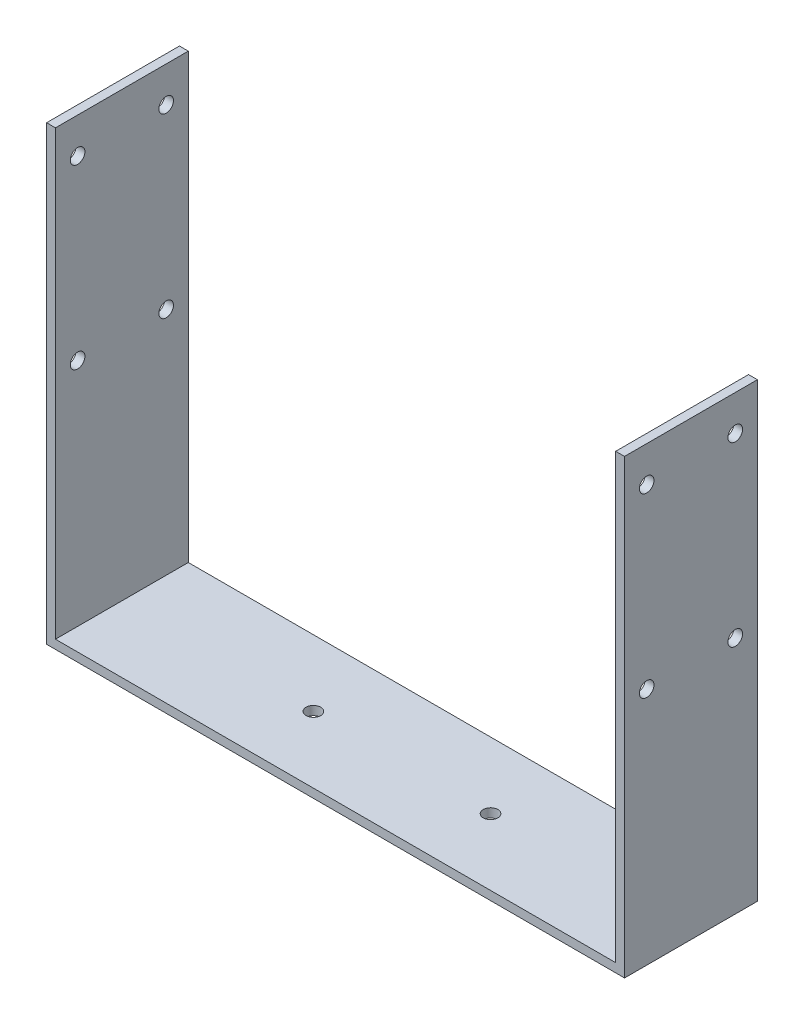
ISO-10303-21;
HEADER;
FILE_DESCRIPTION(('STEP AP214'),'2;1');
FILE_NAME('part.step','',(''),(''),'','','');
FILE_SCHEMA(('AUTOMOTIVE_DESIGN { 1 0 10303 214 1 1 1 1 }'));
ENDSEC;
DATA;
#1=APPLICATION_CONTEXT('core data for automotive mechanical design processes');
#2=APPLICATION_PROTOCOL_DEFINITION('international standard','automotive_design',2000,#1);
#3=PRODUCT_CONTEXT('',#1,'mechanical');
#4=PRODUCT('Part','Part','',(#3));
#5=PRODUCT_RELATED_PRODUCT_CATEGORY('part','',(#4));
#6=PRODUCT_DEFINITION_FORMATION('','',#4);
#7=PRODUCT_DEFINITION_CONTEXT('part definition',#1,'design');
#8=PRODUCT_DEFINITION('design','',#6,#7);
#9=PRODUCT_DEFINITION_SHAPE('','',#8);
#10=(LENGTH_UNIT() NAMED_UNIT(*) SI_UNIT(.MILLI.,.METRE.));
#11=(NAMED_UNIT(*) PLANE_ANGLE_UNIT() SI_UNIT($,.RADIAN.));
#12=(NAMED_UNIT(*) SI_UNIT($,.STERADIAN.) SOLID_ANGLE_UNIT());
#13=UNCERTAINTY_MEASURE_WITH_UNIT(LENGTH_MEASURE(1.E-05),#10,'distance_accuracy_value','');
#14=(GEOMETRIC_REPRESENTATION_CONTEXT(3) GLOBAL_UNCERTAINTY_ASSIGNED_CONTEXT((#13)) GLOBAL_UNIT_ASSIGNED_CONTEXT((#10,
#11,#12)) REPRESENTATION_CONTEXT('',''));
#15=CARTESIAN_POINT('',(0.,0.,0.));
#16=DIRECTION('',(0.,0.,1.));
#17=DIRECTION('',(1.,0.,0.));
#18=AXIS2_PLACEMENT_3D('',#15,#16,#17);
#19=CARTESIAN_POINT('',(0.,0.,30.));
#20=DIRECTION('',(-1.,0.,0.));
#21=DIRECTION('',(0.,0.,1.));
#22=AXIS2_PLACEMENT_3D('',#19,#20,#21);
#23=PLANE('',#22);
#24=CARTESIAN_POINT('',(0.,92.,5.));
#25=DIRECTION('',(-1.,0.,0.));
#26=DIRECTION('',(0.,0.,1.));
#27=AXIS2_PLACEMENT_3D('',#24,#25,#26);
#28=CIRCLE('',#27,1.65);
#29=CARTESIAN_POINT('',(0.,92.,6.65));
#30=VERTEX_POINT('',#29);
#31=EDGE_CURVE('E190',#30,#30,#28,.F.);
#32=ORIENTED_EDGE('',*,*,#31,.F.);
#33=EDGE_LOOP('',(#32));
#34=FACE_BOUND('',#33,.T.);
#35=DIRECTION('',(0.,1.,0.));
#36=VECTOR('',#35,1.);
#37=CARTESIAN_POINT('',(0.,0.,0.));
#38=LINE('',#37,#36);
#39=CARTESIAN_POINT('',(0.,0.,0.));
#40=VERTEX_POINT('',#39);
#41=CARTESIAN_POINT('',(0.,100.,0.));
#42=VERTEX_POINT('',#41);
#43=EDGE_CURVE('E144',#40,#42,#38,.T.);
#44=ORIENTED_EDGE('',*,*,#43,.T.);
#45=DIRECTION('',(0.,0.,-1.));
#46=VECTOR('',#45,1.);
#47=CARTESIAN_POINT('',(0.,100.,30.));
#48=LINE('',#47,#46);
#49=CARTESIAN_POINT('',(0.,100.,30.));
#50=VERTEX_POINT('',#49);
#51=EDGE_CURVE('E11',#50,#42,#48,.T.);
#52=ORIENTED_EDGE('',*,*,#51,.F.);
#53=DIRECTION('',(0.,1.,0.));
#54=VECTOR('',#53,1.);
#55=CARTESIAN_POINT('',(0.,0.,30.));
#56=LINE('',#55,#54);
#57=CARTESIAN_POINT('',(0.,0.,30.));
#58=VERTEX_POINT('',#57);
#59=EDGE_CURVE('E167',#58,#50,#56,.T.);
#60=ORIENTED_EDGE('',*,*,#59,.F.);
#61=DIRECTION('',(0.,0.,-1.));
#62=VECTOR('',#61,1.);
#63=CARTESIAN_POINT('',(0.,0.,30.));
#64=LINE('',#63,#62);
#65=EDGE_CURVE('E140',#58,#40,#64,.T.);
#66=ORIENTED_EDGE('',*,*,#65,.T.);
#67=EDGE_LOOP('',(#44,#52,#60,#66));
#68=FACE_BOUND('',#67,.T.);
#69=CARTESIAN_POINT('',(0.,92.,25.));
#70=DIRECTION('',(-1.,0.,0.));
#71=DIRECTION('',(0.,0.,1.));
#72=AXIS2_PLACEMENT_3D('',#69,#70,#71);
#73=CIRCLE('',#72,1.65);
#74=CARTESIAN_POINT('',(0.,92.,26.65));
#75=VERTEX_POINT('',#74);
#76=EDGE_CURVE('E149',#75,#75,#73,.T.);
#77=ORIENTED_EDGE('',*,*,#76,.T.);
#78=EDGE_LOOP('',(#77));
#79=FACE_BOUND('',#78,.T.);
#80=CARTESIAN_POINT('',(0.,52.,5.));
#81=DIRECTION('',(-1.,0.,0.));
#82=DIRECTION('',(0.,0.,1.));
#83=AXIS2_PLACEMENT_3D('',#80,#81,#82);
#84=CIRCLE('',#83,1.65);
#85=CARTESIAN_POINT('',(0.,52.,6.65));
#86=VERTEX_POINT('',#85);
#87=EDGE_CURVE('E200',#86,#86,#84,.F.);
#88=ORIENTED_EDGE('',*,*,#87,.F.);
#89=EDGE_LOOP('',(#88));
#90=FACE_BOUND('',#89,.T.);
#91=CARTESIAN_POINT('',(0.,52.,25.));
#92=DIRECTION('',(-1.,0.,0.));
#93=DIRECTION('',(0.,0.,1.));
#94=AXIS2_PLACEMENT_3D('',#91,#92,#93);
#95=CIRCLE('',#94,1.65);
#96=CARTESIAN_POINT('',(0.,52.,26.65));
#97=VERTEX_POINT('',#96);
#98=EDGE_CURVE('E223',#97,#97,#95,.T.);
#99=ORIENTED_EDGE('',*,*,#98,.T.);
#100=EDGE_LOOP('',(#99));
#101=FACE_BOUND('',#100,.T.);
#102=ADVANCED_FACE('F17',(#34,#68,#79,#90,#101),#23,.F.);
#103=CARTESIAN_POINT('',(-2.,-2.,30.));
#104=DIRECTION('',(1.,0.,0.));
#105=DIRECTION('',(0.,0.,-1.));
#106=AXIS2_PLACEMENT_3D('',#103,#104,#105);
#107=PLANE('',#106);
#108=CARTESIAN_POINT('',(-2.,92.,5.));
#109=DIRECTION('',(1.,0.,0.));
#110=DIRECTION('',(0.,0.,-1.));
#111=AXIS2_PLACEMENT_3D('',#108,#109,#110);
#112=CIRCLE('',#111,1.65);
#113=CARTESIAN_POINT('',(-2.,92.,3.35));
#114=VERTEX_POINT('',#113);
#115=EDGE_CURVE('E231',#114,#114,#112,.F.);
#116=ORIENTED_EDGE('',*,*,#115,.F.);
#117=EDGE_LOOP('',(#116));
#118=FACE_BOUND('',#117,.T.);
#119=DIRECTION('',(0.,-1.,0.));
#120=VECTOR('',#119,1.);
#121=CARTESIAN_POINT('',(-2.,-2.,0.));
#122=LINE('',#121,#120);
#123=CARTESIAN_POINT('',(-2.,100.,0.));
#124=VERTEX_POINT('',#123);
#125=CARTESIAN_POINT('',(-2.,-2.,0.));
#126=VERTEX_POINT('',#125);
#127=EDGE_CURVE('E152',#124,#126,#122,.T.);
#128=ORIENTED_EDGE('',*,*,#127,.T.);
#129=DIRECTION('',(0.,0.,-1.));
#130=VECTOR('',#129,1.);
#131=CARTESIAN_POINT('',(-2.,-2.,30.));
#132=LINE('',#131,#130);
#133=CARTESIAN_POINT('',(-2.,-2.,30.));
#134=VERTEX_POINT('',#133);
#135=EDGE_CURVE('E178',#134,#126,#132,.T.);
#136=ORIENTED_EDGE('',*,*,#135,.F.);
#137=DIRECTION('',(0.,-1.,0.));
#138=VECTOR('',#137,1.);
#139=CARTESIAN_POINT('',(-2.,-2.,30.));
#140=LINE('',#139,#138);
#141=CARTESIAN_POINT('',(-2.,100.,30.));
#142=VERTEX_POINT('',#141);
#143=EDGE_CURVE('E252',#142,#134,#140,.T.);
#144=ORIENTED_EDGE('',*,*,#143,.F.);
#145=DIRECTION('',(0.,0.,-1.));
#146=VECTOR('',#145,1.);
#147=CARTESIAN_POINT('',(-2.,100.,30.));
#148=LINE('',#147,#146);
#149=EDGE_CURVE('E27',#142,#124,#148,.T.);
#150=ORIENTED_EDGE('',*,*,#149,.T.);
#151=EDGE_LOOP('',(#128,#136,#144,#150));
#152=FACE_BOUND('',#151,.T.);
#153=CARTESIAN_POINT('',(-2.,92.,25.));
#154=DIRECTION('',(1.,0.,0.));
#155=DIRECTION('',(0.,0.,-1.));
#156=AXIS2_PLACEMENT_3D('',#153,#154,#155);
#157=CIRCLE('',#156,1.65);
#158=CARTESIAN_POINT('',(-2.,92.,23.35));
#159=VERTEX_POINT('',#158);
#160=EDGE_CURVE('E241',#159,#159,#157,.T.);
#161=ORIENTED_EDGE('',*,*,#160,.T.);
#162=EDGE_LOOP('',(#161));
#163=FACE_BOUND('',#162,.T.);
#164=CARTESIAN_POINT('',(-2.,52.,5.));
#165=DIRECTION('',(1.,0.,0.));
#166=DIRECTION('',(0.,0.,-1.));
#167=AXIS2_PLACEMENT_3D('',#164,#165,#166);
#168=CIRCLE('',#167,1.65);
#169=CARTESIAN_POINT('',(-2.,52.,3.35));
#170=VERTEX_POINT('',#169);
#171=EDGE_CURVE('E210',#170,#170,#168,.F.);
#172=ORIENTED_EDGE('',*,*,#171,.F.);
#173=EDGE_LOOP('',(#172));
#174=FACE_BOUND('',#173,.T.);
#175=CARTESIAN_POINT('',(-2.,52.,25.));
#176=DIRECTION('',(1.,0.,0.));
#177=DIRECTION('',(0.,0.,-1.));
#178=AXIS2_PLACEMENT_3D('',#175,#176,#177);
#179=CIRCLE('',#178,1.65);
#180=CARTESIAN_POINT('',(-2.,52.,23.35));
#181=VERTEX_POINT('',#180);
#182=EDGE_CURVE('E207',#181,#181,#179,.T.);
#183=ORIENTED_EDGE('',*,*,#182,.T.);
#184=EDGE_LOOP('',(#183));
#185=FACE_BOUND('',#184,.T.);
#186=ADVANCED_FACE('F302',(#118,#152,#163,#174,#185),#107,.F.);
#187=CARTESIAN_POINT('',(128.5,-2.,30.));
#188=DIRECTION('',(-1.,0.,0.));
#189=DIRECTION('',(0.,0.,1.));
#190=AXIS2_PLACEMENT_3D('',#187,#188,#189);
#191=PLANE('',#190);
#192=CARTESIAN_POINT('',(128.5,92.,5.));
#193=DIRECTION('',(-1.,0.,0.));
#194=DIRECTION('',(0.,0.,1.));
#195=AXIS2_PLACEMENT_3D('',#192,#193,#194);
#196=CIRCLE('',#195,1.65);
#197=CARTESIAN_POINT('',(128.5,92.,6.65));
#198=VERTEX_POINT('',#197);
#199=EDGE_CURVE('E227',#198,#198,#196,.F.);
#200=ORIENTED_EDGE('',*,*,#199,.F.);
#201=EDGE_LOOP('',(#200));
#202=FACE_BOUND('',#201,.T.);
#203=DIRECTION('',(0.,1.,0.));
#204=VECTOR('',#203,1.);
#205=CARTESIAN_POINT('',(128.5,-2.,0.));
#206=LINE('',#205,#204);
#207=CARTESIAN_POINT('',(128.5,-2.,0.));
#208=VERTEX_POINT('',#207);
#209=CARTESIAN_POINT('',(128.5,100.,0.));
#210=VERTEX_POINT('',#209);
#211=EDGE_CURVE('E158',#208,#210,#206,.T.);
#212=ORIENTED_EDGE('',*,*,#211,.T.);
#213=DIRECTION('',(0.,0.,-1.));
#214=VECTOR('',#213,1.);
#215=CARTESIAN_POINT('',(128.5,100.,30.));
#216=LINE('',#215,#214);
#217=CARTESIAN_POINT('',(128.5,100.,30.));
#218=VERTEX_POINT('',#217);
#219=EDGE_CURVE('E131',#218,#210,#216,.T.);
#220=ORIENTED_EDGE('',*,*,#219,.F.);
#221=DIRECTION('',(0.,1.,0.));
#222=VECTOR('',#221,1.);
#223=CARTESIAN_POINT('',(128.5,-2.,30.));
#224=LINE('',#223,#222);
#225=CARTESIAN_POINT('',(128.5,-2.,30.));
#226=VERTEX_POINT('',#225);
#227=EDGE_CURVE('E120',#226,#218,#224,.T.);
#228=ORIENTED_EDGE('',*,*,#227,.F.);
#229=DIRECTION('',(0.,0.,-1.));
#230=VECTOR('',#229,1.);
#231=CARTESIAN_POINT('',(128.5,-2.,30.));
#232=LINE('',#231,#230);
#233=EDGE_CURVE('E174',#226,#208,#232,.T.);
#234=ORIENTED_EDGE('',*,*,#233,.T.);
#235=EDGE_LOOP('',(#212,#220,#228,#234));
#236=FACE_BOUND('',#235,.T.);
#237=CARTESIAN_POINT('',(128.5,92.,25.));
#238=DIRECTION('',(-1.,0.,0.));
#239=DIRECTION('',(0.,0.,1.));
#240=AXIS2_PLACEMENT_3D('',#237,#238,#239);
#241=CIRCLE('',#240,1.65);
#242=CARTESIAN_POINT('',(128.5,92.,26.65));
#243=VERTEX_POINT('',#242);
#244=EDGE_CURVE('E189',#243,#243,#241,.T.);
#245=ORIENTED_EDGE('',*,*,#244,.T.);
#246=EDGE_LOOP('',(#245));
#247=FACE_BOUND('',#246,.T.);
#248=CARTESIAN_POINT('',(128.5,52.,5.));
#249=DIRECTION('',(-1.,0.,0.));
#250=DIRECTION('',(0.,0.,1.));
#251=AXIS2_PLACEMENT_3D('',#248,#249,#250);
#252=CIRCLE('',#251,1.65);
#253=CARTESIAN_POINT('',(128.5,52.,6.65));
#254=VERTEX_POINT('',#253);
#255=EDGE_CURVE('E194',#254,#254,#252,.F.);
#256=ORIENTED_EDGE('',*,*,#255,.F.);
#257=EDGE_LOOP('',(#256));
#258=FACE_BOUND('',#257,.T.);
#259=CARTESIAN_POINT('',(128.5,52.,25.));
#260=DIRECTION('',(-1.,0.,0.));
#261=DIRECTION('',(0.,0.,1.));
#262=AXIS2_PLACEMENT_3D('',#259,#260,#261);
#263=CIRCLE('',#262,1.65);
#264=CARTESIAN_POINT('',(128.5,52.,26.65));
#265=VERTEX_POINT('',#264);
#266=EDGE_CURVE('E199',#265,#265,#263,.T.);
#267=ORIENTED_EDGE('',*,*,#266,.T.);
#268=EDGE_LOOP('',(#267));
#269=FACE_BOUND('',#268,.T.);
#270=ADVANCED_FACE('F294',(#202,#236,#247,#258,#269),#191,.F.);
#271=CARTESIAN_POINT('',(126.5,0.,30.));
#272=DIRECTION('',(1.,0.,0.));
#273=DIRECTION('',(0.,0.,-1.));
#274=AXIS2_PLACEMENT_3D('',#271,#272,#273);
#275=PLANE('',#274);
#276=CARTESIAN_POINT('',(126.5,92.,5.));
#277=DIRECTION('',(1.,0.,0.));
#278=DIRECTION('',(0.,0.,-1.));
#279=AXIS2_PLACEMENT_3D('',#276,#277,#278);
#280=CIRCLE('',#279,1.65);
#281=CARTESIAN_POINT('',(126.5,92.,3.35));
#282=VERTEX_POINT('',#281);
#283=EDGE_CURVE('E20',#282,#282,#280,.F.);
#284=ORIENTED_EDGE('',*,*,#283,.F.);
#285=EDGE_LOOP('',(#284));
#286=FACE_BOUND('',#285,.T.);
#287=DIRECTION('',(0.,-1.,0.));
#288=VECTOR('',#287,1.);
#289=CARTESIAN_POINT('',(126.5,0.,0.));
#290=LINE('',#289,#288);
#291=CARTESIAN_POINT('',(126.5,100.,0.));
#292=VERTEX_POINT('',#291);
#293=CARTESIAN_POINT('',(126.5,0.,0.));
#294=VERTEX_POINT('',#293);
#295=EDGE_CURVE('E78',#292,#294,#290,.T.);
#296=ORIENTED_EDGE('',*,*,#295,.T.);
#297=DIRECTION('',(0.,0.,-1.));
#298=VECTOR('',#297,1.);
#299=CARTESIAN_POINT('',(126.5,0.,30.));
#300=LINE('',#299,#298);
#301=CARTESIAN_POINT('',(126.5,0.,30.));
#302=VERTEX_POINT('',#301);
#303=EDGE_CURVE('E132',#302,#294,#300,.T.);
#304=ORIENTED_EDGE('',*,*,#303,.F.);
#305=DIRECTION('',(0.,-1.,0.));
#306=VECTOR('',#305,1.);
#307=CARTESIAN_POINT('',(126.5,0.,30.));
#308=LINE('',#307,#306);
#309=CARTESIAN_POINT('',(126.5,100.,30.));
#310=VERTEX_POINT('',#309);
#311=EDGE_CURVE('E118',#310,#302,#308,.T.);
#312=ORIENTED_EDGE('',*,*,#311,.F.);
#313=DIRECTION('',(0.,0.,-1.));
#314=VECTOR('',#313,1.);
#315=CARTESIAN_POINT('',(126.5,100.,30.));
#316=LINE('',#315,#314);
#317=EDGE_CURVE('E126',#310,#292,#316,.T.);
#318=ORIENTED_EDGE('',*,*,#317,.T.);
#319=EDGE_LOOP('',(#296,#304,#312,#318));
#320=FACE_BOUND('',#319,.T.);
#321=CARTESIAN_POINT('',(126.5,92.,25.));
#322=DIRECTION('',(1.,0.,0.));
#323=DIRECTION('',(0.,0.,-1.));
#324=AXIS2_PLACEMENT_3D('',#321,#322,#323);
#325=CIRCLE('',#324,1.65);
#326=CARTESIAN_POINT('',(126.5,92.,23.35));
#327=VERTEX_POINT('',#326);
#328=EDGE_CURVE('E185',#327,#327,#325,.T.);
#329=ORIENTED_EDGE('',*,*,#328,.T.);
#330=EDGE_LOOP('',(#329));
#331=FACE_BOUND('',#330,.T.);
#332=CARTESIAN_POINT('',(126.5,52.,5.));
#333=DIRECTION('',(1.,0.,0.));
#334=DIRECTION('',(0.,0.,-1.));
#335=AXIS2_PLACEMENT_3D('',#332,#333,#334);
#336=CIRCLE('',#335,1.65);
#337=CARTESIAN_POINT('',(126.5,52.,3.35));
#338=VERTEX_POINT('',#337);
#339=EDGE_CURVE('E191',#338,#338,#336,.F.);
#340=ORIENTED_EDGE('',*,*,#339,.F.);
#341=EDGE_LOOP('',(#340));
#342=FACE_BOUND('',#341,.T.);
#343=CARTESIAN_POINT('',(126.5,52.,25.));
#344=DIRECTION('',(1.,0.,0.));
#345=DIRECTION('',(0.,0.,-1.));
#346=AXIS2_PLACEMENT_3D('',#343,#344,#345);
#347=CIRCLE('',#346,1.65);
#348=CARTESIAN_POINT('',(126.5,52.,23.35));
#349=VERTEX_POINT('',#348);
#350=EDGE_CURVE('E196',#349,#349,#347,.T.);
#351=ORIENTED_EDGE('',*,*,#350,.T.);
#352=EDGE_LOOP('',(#351));
#353=FACE_BOUND('',#352,.T.);
#354=ADVANCED_FACE('F134',(#286,#320,#331,#342,#353),#275,.F.);
#355=CARTESIAN_POINT('',(-2.,100.,30.));
#356=DIRECTION('',(0.,-1.,0.));
#357=DIRECTION('',(0.,0.,-1.));
#358=AXIS2_PLACEMENT_3D('',#355,#356,#357);
#359=PLANE('',#358);
#360=DIRECTION('',(-1.,0.,0.));
#361=VECTOR('',#360,1.);
#362=CARTESIAN_POINT('',(-2.,100.,0.));
#363=LINE('',#362,#361);
#364=EDGE_CURVE('E148',#42,#124,#363,.T.);
#365=ORIENTED_EDGE('',*,*,#364,.T.);
#366=ORIENTED_EDGE('',*,*,#149,.F.);
#367=DIRECTION('',(-1.,0.,0.));
#368=VECTOR('',#367,1.);
#369=CARTESIAN_POINT('',(-2.,100.,30.));
#370=LINE('',#369,#368);
#371=EDGE_CURVE('E96',#50,#142,#370,.T.);
#372=ORIENTED_EDGE('',*,*,#371,.F.);
#373=ORIENTED_EDGE('',*,*,#51,.T.);
#374=EDGE_LOOP('',(#365,#366,#372,#373));
#375=FACE_BOUND('',#374,.T.);
#376=ADVANCED_FACE('F293',(#375),#359,.F.);
#377=CARTESIAN_POINT('',(-2.,-2.,30.));
#378=DIRECTION('',(0.,1.,0.));
#379=DIRECTION('',(0.,0.,1.));
#380=AXIS2_PLACEMENT_3D('',#377,#378,#379);
#381=PLANE('',#380);
#382=CARTESIAN_POINT('',(83.24,-2.,15.));
#383=DIRECTION('',(0.,1.,0.));
#384=DIRECTION('',(0.,0.,1.));
#385=AXIS2_PLACEMENT_3D('',#382,#383,#384);
#386=CIRCLE('',#385,1.65);
#387=CARTESIAN_POINT('',(83.24,-2.,16.65));
#388=VERTEX_POINT('',#387);
#389=EDGE_CURVE('E381',#388,#388,#386,.T.);
#390=ORIENTED_EDGE('',*,*,#389,.T.);
#391=EDGE_LOOP('',(#390));
#392=FACE_BOUND('',#391,.T.);
#393=CARTESIAN_POINT('',(43.24,-2.,15.));
#394=DIRECTION('',(0.,1.,0.));
#395=DIRECTION('',(0.,0.,1.));
#396=AXIS2_PLACEMENT_3D('',#393,#394,#395);
#397=CIRCLE('',#396,1.65);
#398=CARTESIAN_POINT('',(43.24,-2.,16.65));
#399=VERTEX_POINT('',#398);
#400=EDGE_CURVE('E195',#399,#399,#397,.T.);
#401=ORIENTED_EDGE('',*,*,#400,.T.);
#402=EDGE_LOOP('',(#401));
#403=FACE_BOUND('',#402,.T.);
#404=DIRECTION('',(1.,0.,0.));
#405=VECTOR('',#404,1.);
#406=CARTESIAN_POINT('',(-2.,-2.,0.));
#407=LINE('',#406,#405);
#408=EDGE_CURVE('E155',#126,#208,#407,.T.);
#409=ORIENTED_EDGE('',*,*,#408,.T.);
#410=ORIENTED_EDGE('',*,*,#233,.F.);
#411=DIRECTION('',(1.,0.,0.));
#412=VECTOR('',#411,1.);
#413=CARTESIAN_POINT('',(-2.,-2.,30.));
#414=LINE('',#413,#412);
#415=EDGE_CURVE('E255',#134,#226,#414,.T.);
#416=ORIENTED_EDGE('',*,*,#415,.F.);
#417=ORIENTED_EDGE('',*,*,#135,.T.);
#418=EDGE_LOOP('',(#409,#410,#416,#417));
#419=FACE_BOUND('',#418,.T.);
#420=ADVANCED_FACE('F301',(#392,#403,#419),#381,.F.);
#421=CARTESIAN_POINT('',(126.5,100.,30.));
#422=DIRECTION('',(0.,-1.,0.));
#423=DIRECTION('',(0.,0.,-1.));
#424=AXIS2_PLACEMENT_3D('',#421,#422,#423);
#425=PLANE('',#424);
#426=DIRECTION('',(-1.,0.,0.));
#427=VECTOR('',#426,1.);
#428=CARTESIAN_POINT('',(126.5,100.,0.));
#429=LINE('',#428,#427);
#430=EDGE_CURVE('E129',#210,#292,#429,.T.);
#431=ORIENTED_EDGE('',*,*,#430,.T.);
#432=ORIENTED_EDGE('',*,*,#317,.F.);
#433=DIRECTION('',(-1.,0.,0.));
#434=VECTOR('',#433,1.);
#435=CARTESIAN_POINT('',(126.5,100.,30.));
#436=LINE('',#435,#434);
#437=EDGE_CURVE('E114',#218,#310,#436,.T.);
#438=ORIENTED_EDGE('',*,*,#437,.F.);
#439=ORIENTED_EDGE('',*,*,#219,.T.);
#440=EDGE_LOOP('',(#431,#432,#438,#439));
#441=FACE_BOUND('',#440,.T.);
#442=ADVANCED_FACE('F127',(#441),#425,.F.);
#443=CARTESIAN_POINT('',(0.,0.,30.));
#444=DIRECTION('',(0.,-1.,0.));
#445=DIRECTION('',(0.,0.,-1.));
#446=AXIS2_PLACEMENT_3D('',#443,#444,#445);
#447=PLANE('',#446);
#448=CARTESIAN_POINT('',(83.24,0.,15.));
#449=DIRECTION('',(0.,1.,0.));
#450=DIRECTION('',(0.,0.,1.));
#451=AXIS2_PLACEMENT_3D('',#448,#449,#450);
#452=CIRCLE('',#451,1.65);
#453=CARTESIAN_POINT('',(83.24,0.,16.65));
#454=VERTEX_POINT('',#453);
#455=EDGE_CURVE('E375',#454,#454,#452,.T.);
#456=ORIENTED_EDGE('',*,*,#455,.F.);
#457=EDGE_LOOP('',(#456));
#458=FACE_BOUND('',#457,.T.);
#459=CARTESIAN_POINT('',(43.24,0.,15.));
#460=DIRECTION('',(0.,1.,0.));
#461=DIRECTION('',(0.,0.,1.));
#462=AXIS2_PLACEMENT_3D('',#459,#460,#461);
#463=CIRCLE('',#462,1.65);
#464=CARTESIAN_POINT('',(43.24,0.,16.65));
#465=VERTEX_POINT('',#464);
#466=EDGE_CURVE('E378',#465,#465,#463,.T.);
#467=ORIENTED_EDGE('',*,*,#466,.F.);
#468=EDGE_LOOP('',(#467));
#469=FACE_BOUND('',#468,.T.);
#470=DIRECTION('',(-1.,0.,0.));
#471=VECTOR('',#470,1.);
#472=CARTESIAN_POINT('',(0.,0.,0.));
#473=LINE('',#472,#471);
#474=EDGE_CURVE('E86',#294,#40,#473,.T.);
#475=ORIENTED_EDGE('',*,*,#474,.T.);
#476=ORIENTED_EDGE('',*,*,#65,.F.);
#477=DIRECTION('',(-1.,0.,0.));
#478=VECTOR('',#477,1.);
#479=CARTESIAN_POINT('',(0.,0.,30.));
#480=LINE('',#479,#478);
#481=EDGE_CURVE('E40',#302,#58,#480,.T.);
#482=ORIENTED_EDGE('',*,*,#481,.F.);
#483=ORIENTED_EDGE('',*,*,#303,.T.);
#484=EDGE_LOOP('',(#475,#476,#482,#483));
#485=FACE_BOUND('',#484,.T.);
#486=ADVANCED_FACE('F364',(#458,#469,#485),#447,.F.);
#487=CARTESIAN_POINT('',(0.,0.,30.));
#488=DIRECTION('',(0.,0.,-1.));
#489=DIRECTION('',(-1.,0.,0.));
#490=AXIS2_PLACEMENT_3D('',#487,#488,#489);
#491=PLANE('',#490);
#492=ORIENTED_EDGE('',*,*,#59,.T.);
#493=ORIENTED_EDGE('',*,*,#371,.T.);
#494=ORIENTED_EDGE('',*,*,#143,.T.);
#495=ORIENTED_EDGE('',*,*,#415,.T.);
#496=ORIENTED_EDGE('',*,*,#227,.T.);
#497=ORIENTED_EDGE('',*,*,#437,.T.);
#498=ORIENTED_EDGE('',*,*,#311,.T.);
#499=ORIENTED_EDGE('',*,*,#481,.T.);
#500=EDGE_LOOP('',(#492,#493,#494,#495,#496,#497,#498,#499));
#501=FACE_BOUND('',#500,.T.);
#502=ADVANCED_FACE('F116',(#501),#491,.F.);
#503=CARTESIAN_POINT('',(0.,0.,0.));
#504=DIRECTION('',(0.,0.,-1.));
#505=DIRECTION('',(-1.,0.,0.));
#506=AXIS2_PLACEMENT_3D('',#503,#504,#505);
#507=PLANE('',#506);
#508=ORIENTED_EDGE('',*,*,#43,.F.);
#509=ORIENTED_EDGE('',*,*,#474,.F.);
#510=ORIENTED_EDGE('',*,*,#295,.F.);
#511=ORIENTED_EDGE('',*,*,#430,.F.);
#512=ORIENTED_EDGE('',*,*,#211,.F.);
#513=ORIENTED_EDGE('',*,*,#408,.F.);
#514=ORIENTED_EDGE('',*,*,#127,.F.);
#515=ORIENTED_EDGE('',*,*,#364,.F.);
#516=EDGE_LOOP('',(#508,#509,#510,#511,#512,#513,#514,#515));
#517=FACE_BOUND('',#516,.T.);
#518=ADVANCED_FACE('F363',(#517),#507,.T.);
#519=CARTESIAN_POINT('',(150.,92.,25.));
#520=DIRECTION('',(-1.,0.,0.));
#521=DIRECTION('',(0.,0.,1.));
#522=AXIS2_PLACEMENT_3D('',#519,#520,#521);
#523=CYLINDRICAL_SURFACE('',#522,1.65);
#524=ORIENTED_EDGE('',*,*,#328,.F.);
#525=EDGE_LOOP('',(#524));
#526=FACE_BOUND('',#525,.T.);
#527=ORIENTED_EDGE('',*,*,#244,.F.);
#528=EDGE_LOOP('',(#527));
#529=FACE_BOUND('',#528,.T.);
#530=ADVANCED_FACE('F356',(#526,#529),#523,.F.);
#531=ORIENTED_EDGE('',*,*,#160,.F.);
#532=EDGE_LOOP('',(#531));
#533=FACE_BOUND('',#532,.T.);
#534=ORIENTED_EDGE('',*,*,#76,.F.);
#535=EDGE_LOOP('',(#534));
#536=FACE_BOUND('',#535,.T.);
#537=ADVANCED_FACE('F348',(#533,#536),#523,.F.);
#538=CARTESIAN_POINT('',(150.,52.,5.));
#539=DIRECTION('',(-1.,0.,0.));
#540=DIRECTION('',(0.,0.,1.));
#541=AXIS2_PLACEMENT_3D('',#538,#539,#540);
#542=CYLINDRICAL_SURFACE('',#541,1.65);
#543=ORIENTED_EDGE('',*,*,#339,.T.);
#544=EDGE_LOOP('',(#543));
#545=FACE_BOUND('',#544,.T.);
#546=ORIENTED_EDGE('',*,*,#255,.T.);
#547=EDGE_LOOP('',(#546));
#548=FACE_BOUND('',#547,.T.);
#549=ADVANCED_FACE('F340',(#545,#548),#542,.F.);
#550=CARTESIAN_POINT('',(150.,52.,25.));
#551=DIRECTION('',(-1.,0.,0.));
#552=DIRECTION('',(0.,0.,1.));
#553=AXIS2_PLACEMENT_3D('',#550,#551,#552);
#554=CYLINDRICAL_SURFACE('',#553,1.65);
#555=ORIENTED_EDGE('',*,*,#350,.F.);
#556=EDGE_LOOP('',(#555));
#557=FACE_BOUND('',#556,.T.);
#558=ORIENTED_EDGE('',*,*,#266,.F.);
#559=EDGE_LOOP('',(#558));
#560=FACE_BOUND('',#559,.T.);
#561=ADVANCED_FACE('F330',(#557,#560),#554,.F.);
#562=CARTESIAN_POINT('',(150.,92.,5.));
#563=DIRECTION('',(-1.,0.,0.));
#564=DIRECTION('',(0.,0.,1.));
#565=AXIS2_PLACEMENT_3D('',#562,#563,#564);
#566=CYLINDRICAL_SURFACE('',#565,1.65);
#567=ORIENTED_EDGE('',*,*,#283,.T.);
#568=EDGE_LOOP('',(#567));
#569=FACE_BOUND('',#568,.T.);
#570=ORIENTED_EDGE('',*,*,#199,.T.);
#571=EDGE_LOOP('',(#570));
#572=FACE_BOUND('',#571,.T.);
#573=ADVANCED_FACE('F289',(#569,#572),#566,.F.);
#574=ORIENTED_EDGE('',*,*,#171,.T.);
#575=EDGE_LOOP('',(#574));
#576=FACE_BOUND('',#575,.T.);
#577=ORIENTED_EDGE('',*,*,#87,.T.);
#578=EDGE_LOOP('',(#577));
#579=FACE_BOUND('',#578,.T.);
#580=ADVANCED_FACE('F327',(#576,#579),#542,.F.);
#581=ORIENTED_EDGE('',*,*,#182,.F.);
#582=EDGE_LOOP('',(#581));
#583=FACE_BOUND('',#582,.T.);
#584=ORIENTED_EDGE('',*,*,#98,.F.);
#585=EDGE_LOOP('',(#584));
#586=FACE_BOUND('',#585,.T.);
#587=ADVANCED_FACE('F324',(#583,#586),#554,.F.);
#588=ORIENTED_EDGE('',*,*,#115,.T.);
#589=EDGE_LOOP('',(#588));
#590=FACE_BOUND('',#589,.T.);
#591=ORIENTED_EDGE('',*,*,#31,.T.);
#592=EDGE_LOOP('',(#591));
#593=FACE_BOUND('',#592,.T.);
#594=ADVANCED_FACE('F326',(#590,#593),#566,.F.);
#595=CARTESIAN_POINT('',(43.24,-10.,15.));
#596=DIRECTION('',(0.,1.,0.));
#597=DIRECTION('',(0.,0.,1.));
#598=AXIS2_PLACEMENT_3D('',#595,#596,#597);
#599=CYLINDRICAL_SURFACE('',#598,1.65);
#600=ORIENTED_EDGE('',*,*,#466,.T.);
#601=EDGE_LOOP('',(#600));
#602=FACE_BOUND('',#601,.T.);
#603=ORIENTED_EDGE('',*,*,#400,.F.);
#604=EDGE_LOOP('',(#603));
#605=FACE_BOUND('',#604,.T.);
#606=ADVANCED_FACE('F335',(#602,#605),#599,.F.);
#607=CARTESIAN_POINT('',(83.24,-10.,15.));
#608=DIRECTION('',(0.,1.,0.));
#609=DIRECTION('',(0.,0.,1.));
#610=AXIS2_PLACEMENT_3D('',#607,#608,#609);
#611=CYLINDRICAL_SURFACE('',#610,1.65);
#612=ORIENTED_EDGE('',*,*,#455,.T.);
#613=EDGE_LOOP('',(#612));
#614=FACE_BOUND('',#613,.T.);
#615=ORIENTED_EDGE('',*,*,#389,.F.);
#616=EDGE_LOOP('',(#615));
#617=FACE_BOUND('',#616,.T.);
#618=ADVANCED_FACE('F403',(#614,#617),#611,.F.);
#619=CLOSED_SHELL('',(#102,#186,#270,#354,#376,#420,#442,#486,#502,#518,#530,#537,#549,#561,
#573,#580,#587,#594,#606,#618));
#620=MANIFOLD_SOLID_BREP('B1',#619);
#621=ADVANCED_BREP_SHAPE_REPRESENTATION('',(#18,#620),#14);
#622=SHAPE_DEFINITION_REPRESENTATION(#9,#621);
ENDSEC;
END-ISO-10303-21;
